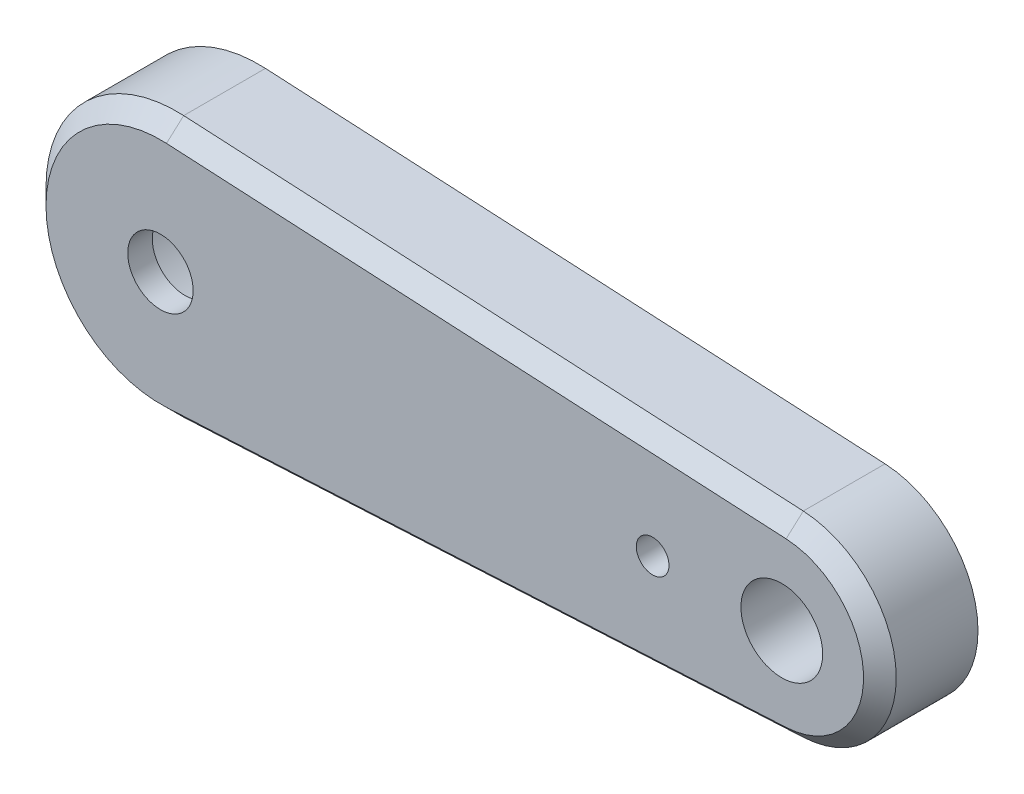
ISO-10303-21;
HEADER;
FILE_DESCRIPTION(('STEP AP214'),'2;1');
FILE_NAME('part.step','',(''),(''),'','','');
FILE_SCHEMA(('AUTOMOTIVE_DESIGN { 1 0 10303 214 1 1 1 1 }'));
ENDSEC;
DATA;
#1=APPLICATION_CONTEXT('core data for automotive mechanical design processes');
#2=APPLICATION_PROTOCOL_DEFINITION('international standard','automotive_design',2000,#1);
#3=PRODUCT_CONTEXT('',#1,'mechanical');
#4=PRODUCT('Part','Part','',(#3));
#5=PRODUCT_RELATED_PRODUCT_CATEGORY('part','',(#4));
#6=PRODUCT_DEFINITION_FORMATION('','',#4);
#7=PRODUCT_DEFINITION_CONTEXT('part definition',#1,'design');
#8=PRODUCT_DEFINITION('design','',#6,#7);
#9=PRODUCT_DEFINITION_SHAPE('','',#8);
#10=(LENGTH_UNIT() NAMED_UNIT(*) SI_UNIT(.MILLI.,.METRE.));
#11=(NAMED_UNIT(*) PLANE_ANGLE_UNIT() SI_UNIT($,.RADIAN.));
#12=(NAMED_UNIT(*) SI_UNIT($,.STERADIAN.) SOLID_ANGLE_UNIT());
#13=UNCERTAINTY_MEASURE_WITH_UNIT(LENGTH_MEASURE(1.E-05),#10,'distance_accuracy_value','');
#14=(GEOMETRIC_REPRESENTATION_CONTEXT(3) GLOBAL_UNCERTAINTY_ASSIGNED_CONTEXT((#13)) GLOBAL_UNIT_ASSIGNED_CONTEXT((#10,
#11,#12)) REPRESENTATION_CONTEXT('',''));
#15=CARTESIAN_POINT('',(0.,0.,0.));
#16=DIRECTION('',(0.,0.,1.));
#17=DIRECTION('',(1.,0.,0.));
#18=AXIS2_PLACEMENT_3D('',#15,#16,#17);
#19=CARTESIAN_POINT('',(0.,0.,3.));
#20=DIRECTION('',(0.,0.,-1.));
#21=DIRECTION('',(-1.,0.,0.));
#22=AXIS2_PLACEMENT_3D('',#19,#20,#21);
#23=CYLINDRICAL_SURFACE('',#22,1.);
#24=CARTESIAN_POINT('',(0.,0.,3.));
#25=DIRECTION('',(0.,0.,1.));
#26=DIRECTION('',(1.,0.,0.));
#27=AXIS2_PLACEMENT_3D('',#24,#25,#26);
#28=CIRCLE('',#27,1.);
#29=CARTESIAN_POINT('',(1.,0.,3.));
#30=VERTEX_POINT('',#29);
#31=EDGE_CURVE('E171',#30,#30,#28,.T.);
#32=ORIENTED_EDGE('',*,*,#31,.T.);
#33=EDGE_LOOP('',(#32));
#34=FACE_BOUND('',#33,.T.);
#35=CARTESIAN_POINT('',(0.,0.,2.25));
#36=DIRECTION('',(0.,0.,-1.));
#37=DIRECTION('',(-1.,0.,0.));
#38=AXIS2_PLACEMENT_3D('',#35,#36,#37);
#39=CIRCLE('',#38,1.);
#40=CARTESIAN_POINT('',(-1.,0.,2.25));
#41=VERTEX_POINT('',#40);
#42=EDGE_CURVE('E158',#41,#41,#39,.T.);
#43=ORIENTED_EDGE('',*,*,#42,.T.);
#44=EDGE_LOOP('',(#43));
#45=FACE_BOUND('',#44,.T.);
#46=ADVANCED_FACE('F43',(#34,#45),#23,.F.);
#47=CARTESIAN_POINT('',(0.,0.,3.));
#48=DIRECTION('',(0.,0.,1.));
#49=DIRECTION('',(1.,0.,0.));
#50=AXIS2_PLACEMENT_3D('',#47,#48,#49);
#51=PLANE('',#50);
#52=CARTESIAN_POINT('',(0.,0.,3.));
#53=DIRECTION('',(0.,0.,1.));
#54=DIRECTION('',(1.,0.,0.));
#55=AXIS2_PLACEMENT_3D('',#52,#53,#54);
#56=CIRCLE('',#55,3.5);
#57=CARTESIAN_POINT('',(0.184210526315789,3.49514899281768,3.));
#58=VERTEX_POINT('',#57);
#59=CARTESIAN_POINT('',(0.184210526315789,-3.49514899281768,3.));
#60=VERTEX_POINT('',#59);
#61=EDGE_CURVE('E201',#58,#60,#56,.T.);
#62=ORIENTED_EDGE('',*,*,#61,.T.);
#63=DIRECTION('',(0.998613997947909,0.0526315789473685,0.));
#64=VECTOR('',#63,1.);
#65=CARTESIAN_POINT('',(19.1315789473684,-2.49653499486977,3.));
#66=LINE('',#65,#64);
#67=CARTESIAN_POINT('',(19.1315789473684,-2.49653499486977,3.));
#68=VERTEX_POINT('',#67);
#69=EDGE_CURVE('E205',#60,#68,#66,.T.);
#70=ORIENTED_EDGE('',*,*,#69,.T.);
#71=CARTESIAN_POINT('',(19.,0.,3.));
#72=DIRECTION('',(0.,0.,1.));
#73=DIRECTION('',(1.,0.,0.));
#74=AXIS2_PLACEMENT_3D('',#71,#72,#73);
#75=CIRCLE('',#74,2.5);
#76=CARTESIAN_POINT('',(19.1315789473684,2.49653499486977,3.));
#77=VERTEX_POINT('',#76);
#78=EDGE_CURVE('E203',#68,#77,#75,.T.);
#79=ORIENTED_EDGE('',*,*,#78,.T.);
#80=DIRECTION('',(-0.998613997947909,0.0526315789473685,0.));
#81=VECTOR('',#80,1.);
#82=CARTESIAN_POINT('',(0.184210526315789,3.49514899281768,3.));
#83=LINE('',#82,#81);
#84=EDGE_CURVE('E196',#77,#58,#83,.T.);
#85=ORIENTED_EDGE('',*,*,#84,.T.);
#86=EDGE_LOOP('',(#62,#70,#79,#85));
#87=FACE_BOUND('',#86,.T.);
#88=CARTESIAN_POINT('',(15.05,0.,3.));
#89=DIRECTION('',(0.,0.,-1.));
#90=DIRECTION('',(-1.,0.,0.));
#91=AXIS2_PLACEMENT_3D('',#88,#89,#90);
#92=CIRCLE('',#91,0.500000000000001);
#93=CARTESIAN_POINT('',(14.55,0.,3.));
#94=VERTEX_POINT('',#93);
#95=EDGE_CURVE('E229',#94,#94,#92,.T.);
#96=ORIENTED_EDGE('',*,*,#95,.T.);
#97=EDGE_LOOP('',(#96));
#98=FACE_BOUND('',#97,.T.);
#99=ORIENTED_EDGE('',*,*,#31,.F.);
#100=EDGE_LOOP('',(#99));
#101=FACE_BOUND('',#100,.T.);
#102=CARTESIAN_POINT('',(19.,0.,3.));
#103=DIRECTION('',(0.,0.,1.));
#104=DIRECTION('',(1.,0.,0.));
#105=AXIS2_PLACEMENT_3D('',#102,#103,#104);
#106=CIRCLE('',#105,1.25);
#107=CARTESIAN_POINT('',(20.25,0.,3.));
#108=VERTEX_POINT('',#107);
#109=EDGE_CURVE('E168',#108,#108,#106,.T.);
#110=ORIENTED_EDGE('',*,*,#109,.F.);
#111=EDGE_LOOP('',(#110));
#112=FACE_BOUND('',#111,.T.);
#113=ADVANCED_FACE('F259',(#87,#98,#101,#112),#51,.T.);
#114=CARTESIAN_POINT('',(0.,0.,0.));
#115=DIRECTION('',(0.,0.,1.));
#116=DIRECTION('',(1.,0.,0.));
#117=AXIS2_PLACEMENT_3D('',#114,#115,#116);
#118=PLANE('',#117);
#119=DIRECTION('',(0.998917748600676,-0.0465116279069769,0.));
#120=VECTOR('',#119,1.);
#121=CARTESIAN_POINT('',(15.1546511627907,2.24756493435152,0.));
#122=LINE('',#121,#120);
#123=CARTESIAN_POINT('',(0.137209302325582,2.94680735837199,0.));
#124=VERTEX_POINT('',#123);
#125=CARTESIAN_POINT('',(15.1546511627907,2.24756493435152,0.));
#126=VERTEX_POINT('',#125);
#127=EDGE_CURVE('E157',#124,#126,#122,.T.);
#128=ORIENTED_EDGE('',*,*,#127,.F.);
#129=CARTESIAN_POINT('',(0.,0.,0.));
#130=DIRECTION('',(0.,0.,-1.));
#131=DIRECTION('',(1.,0.,0.));
#132=AXIS2_PLACEMENT_3D('',#129,#130,#131);
#133=CIRCLE('',#132,2.95);
#134=CARTESIAN_POINT('',(0.137209302325581,-2.94680735837199,0.));
#135=VERTEX_POINT('',#134);
#136=EDGE_CURVE('E128',#135,#124,#133,.T.);
#137=ORIENTED_EDGE('',*,*,#136,.F.);
#138=DIRECTION('',(-0.998917748600676,-0.0465116279069766,0.));
#139=VECTOR('',#138,1.);
#140=CARTESIAN_POINT('',(15.1546511627907,-2.24756493435152,0.));
#141=LINE('',#140,#139);
#142=CARTESIAN_POINT('',(15.1546511627907,-2.24756493435152,0.));
#143=VERTEX_POINT('',#142);
#144=EDGE_CURVE('E145',#143,#135,#141,.T.);
#145=ORIENTED_EDGE('',*,*,#144,.F.);
#146=CARTESIAN_POINT('',(15.05,0.,0.));
#147=DIRECTION('',(0.,0.,-1.));
#148=DIRECTION('',(-1.,0.,0.));
#149=AXIS2_PLACEMENT_3D('',#146,#147,#148);
#150=CIRCLE('',#149,2.25);
#151=EDGE_CURVE('E148',#126,#143,#150,.T.);
#152=ORIENTED_EDGE('',*,*,#151,.F.);
#153=EDGE_LOOP('',(#128,#137,#145,#152));
#154=FACE_BOUND('',#153,.T.);
#155=CARTESIAN_POINT('',(0.,0.,0.));
#156=DIRECTION('',(0.,0.,1.));
#157=DIRECTION('',(1.,0.,0.));
#158=AXIS2_PLACEMENT_3D('',#155,#156,#157);
#159=CIRCLE('',#158,4.);
#160=CARTESIAN_POINT('',(0.210526315789474,3.99445599179164,0.));
#161=VERTEX_POINT('',#160);
#162=CARTESIAN_POINT('',(0.210526315789474,-3.99445599179164,0.));
#163=VERTEX_POINT('',#162);
#164=EDGE_CURVE('E176',#161,#163,#159,.T.);
#165=ORIENTED_EDGE('',*,*,#164,.F.);
#166=DIRECTION('',(-0.998613997947909,0.0526315789473684,0.));
#167=VECTOR('',#166,1.);
#168=CARTESIAN_POINT('',(0.210526315789474,3.99445599179164,0.));
#169=LINE('',#168,#167);
#170=CARTESIAN_POINT('',(19.1578947368421,2.99584199384373,0.));
#171=VERTEX_POINT('',#170);
#172=EDGE_CURVE('E185',#171,#161,#169,.T.);
#173=ORIENTED_EDGE('',*,*,#172,.F.);
#174=CARTESIAN_POINT('',(19.,0.,0.));
#175=DIRECTION('',(0.,0.,1.));
#176=DIRECTION('',(1.,0.,0.));
#177=AXIS2_PLACEMENT_3D('',#174,#175,#176);
#178=CIRCLE('',#177,3.);
#179=CARTESIAN_POINT('',(19.1578947368421,-2.99584199384373,0.));
#180=VERTEX_POINT('',#179);
#181=EDGE_CURVE('E182',#180,#171,#178,.T.);
#182=ORIENTED_EDGE('',*,*,#181,.F.);
#183=DIRECTION('',(0.998613997947909,0.0526315789473685,0.));
#184=VECTOR('',#183,1.);
#185=CARTESIAN_POINT('',(0.210526315789474,-3.99445599179164,0.));
#186=LINE('',#185,#184);
#187=EDGE_CURVE('E179',#163,#180,#186,.T.);
#188=ORIENTED_EDGE('',*,*,#187,.F.);
#189=EDGE_LOOP('',(#165,#173,#182,#188));
#190=FACE_BOUND('',#189,.T.);
#191=CARTESIAN_POINT('',(19.,0.,0.));
#192=DIRECTION('',(0.,0.,1.));
#193=DIRECTION('',(1.,0.,0.));
#194=AXIS2_PLACEMENT_3D('',#191,#192,#193);
#195=CIRCLE('',#194,1.25);
#196=CARTESIAN_POINT('',(20.25,0.,0.));
#197=VERTEX_POINT('',#196);
#198=EDGE_CURVE('E164',#197,#197,#195,.T.);
#199=ORIENTED_EDGE('',*,*,#198,.T.);
#200=EDGE_LOOP('',(#199));
#201=FACE_BOUND('',#200,.T.);
#202=ADVANCED_FACE('F265',(#154,#190,#201),#118,.F.);
#203=CARTESIAN_POINT('',(0.,0.,3.));
#204=DIRECTION('',(0.,0.,-1.));
#205=DIRECTION('',(-1.,0.,0.));
#206=AXIS2_PLACEMENT_3D('',#203,#204,#205);
#207=CYLINDRICAL_SURFACE('',#206,4.);
#208=DIRECTION('',(0.,0.,-1.));
#209=VECTOR('',#208,1.);
#210=CARTESIAN_POINT('',(0.210526315789474,-3.99445599179164,3.));
#211=LINE('',#210,#209);
#212=CARTESIAN_POINT('',(0.210526315789474,-3.99445599179164,2.5));
#213=VERTEX_POINT('',#212);
#214=EDGE_CURVE('E194',#213,#163,#211,.T.);
#215=ORIENTED_EDGE('',*,*,#214,.F.);
#216=CARTESIAN_POINT('',(0.,0.,2.5));
#217=DIRECTION('',(0.,0.,1.));
#218=DIRECTION('',(1.,0.,0.));
#219=AXIS2_PLACEMENT_3D('',#216,#217,#218);
#220=CIRCLE('',#219,4.);
#221=CARTESIAN_POINT('',(0.210526315789474,3.99445599179164,2.5));
#222=VERTEX_POINT('',#221);
#223=EDGE_CURVE('E53',#213,#222,#220,.F.);
#224=ORIENTED_EDGE('',*,*,#223,.T.);
#225=DIRECTION('',(0.,0.,-1.));
#226=VECTOR('',#225,1.);
#227=CARTESIAN_POINT('',(0.210526315789474,3.99445599179164,3.));
#228=LINE('',#227,#226);
#229=EDGE_CURVE('E188',#222,#161,#228,.T.);
#230=ORIENTED_EDGE('',*,*,#229,.T.);
#231=ORIENTED_EDGE('',*,*,#164,.T.);
#232=EDGE_LOOP('',(#215,#224,#230,#231));
#233=FACE_BOUND('',#232,.T.);
#234=ADVANCED_FACE('F275',(#233),#207,.T.);
#235=CARTESIAN_POINT('',(0.210526315789474,-3.99445599179164,3.));
#236=DIRECTION('',(-0.0526315789473685,0.998613997947909,0.));
#237=DIRECTION('',(-0.998613997947909,-0.0526315789473685,0.));
#238=AXIS2_PLACEMENT_3D('',#235,#236,#237);
#239=PLANE('',#238);
#240=DIRECTION('',(0.,0.,-1.));
#241=VECTOR('',#240,1.);
#242=CARTESIAN_POINT('',(19.1578947368421,-2.99584199384373,3.));
#243=LINE('',#242,#241);
#244=CARTESIAN_POINT('',(19.1578947368421,-2.99584199384373,2.5));
#245=VERTEX_POINT('',#244);
#246=EDGE_CURVE('E192',#245,#180,#243,.T.);
#247=ORIENTED_EDGE('',*,*,#246,.F.);
#248=DIRECTION('',(-0.998613997947909,-0.0526315789473685,0.));
#249=VECTOR('',#248,1.);
#250=CARTESIAN_POINT('',(0.210526315789474,-3.99445599179164,2.5));
#251=LINE('',#250,#249);
#252=EDGE_CURVE('E208',#245,#213,#251,.T.);
#253=ORIENTED_EDGE('',*,*,#252,.T.);
#254=ORIENTED_EDGE('',*,*,#214,.T.);
#255=ORIENTED_EDGE('',*,*,#187,.T.);
#256=EDGE_LOOP('',(#247,#253,#254,#255));
#257=FACE_BOUND('',#256,.T.);
#258=ADVANCED_FACE('F283',(#257),#239,.F.);
#259=CARTESIAN_POINT('',(19.,0.,3.));
#260=DIRECTION('',(0.,0.,-1.));
#261=DIRECTION('',(-1.,0.,0.));
#262=AXIS2_PLACEMENT_3D('',#259,#260,#261);
#263=CYLINDRICAL_SURFACE('',#262,3.);
#264=DIRECTION('',(0.,0.,-1.));
#265=VECTOR('',#264,1.);
#266=CARTESIAN_POINT('',(19.1578947368421,2.99584199384373,3.));
#267=LINE('',#266,#265);
#268=CARTESIAN_POINT('',(19.1578947368421,2.99584199384373,2.5));
#269=VERTEX_POINT('',#268);
#270=EDGE_CURVE('E190',#269,#171,#267,.T.);
#271=ORIENTED_EDGE('',*,*,#270,.F.);
#272=CARTESIAN_POINT('',(19.,0.,2.5));
#273=DIRECTION('',(0.,0.,1.));
#274=DIRECTION('',(1.,0.,0.));
#275=AXIS2_PLACEMENT_3D('',#272,#273,#274);
#276=CIRCLE('',#275,3.);
#277=EDGE_CURVE('E211',#269,#245,#276,.F.);
#278=ORIENTED_EDGE('',*,*,#277,.T.);
#279=ORIENTED_EDGE('',*,*,#246,.T.);
#280=ORIENTED_EDGE('',*,*,#181,.T.);
#281=EDGE_LOOP('',(#271,#278,#279,#280));
#282=FACE_BOUND('',#281,.T.);
#283=ADVANCED_FACE('F280',(#282),#263,.T.);
#284=CARTESIAN_POINT('',(0.210526315789474,3.99445599179164,3.));
#285=DIRECTION('',(-0.0526315789473684,-0.998613997947909,0.));
#286=DIRECTION('',(0.998613997947909,-0.0526315789473685,0.));
#287=AXIS2_PLACEMENT_3D('',#284,#285,#286);
#288=PLANE('',#287);
#289=ORIENTED_EDGE('',*,*,#229,.F.);
#290=DIRECTION('',(0.998613997947909,-0.0526315789473685,0.));
#291=VECTOR('',#290,1.);
#292=CARTESIAN_POINT('',(19.1578947368421,2.99584199384373,2.5));
#293=LINE('',#292,#291);
#294=EDGE_CURVE('E11',#222,#269,#293,.T.);
#295=ORIENTED_EDGE('',*,*,#294,.T.);
#296=ORIENTED_EDGE('',*,*,#270,.T.);
#297=ORIENTED_EDGE('',*,*,#172,.T.);
#298=EDGE_LOOP('',(#289,#295,#296,#297));
#299=FACE_BOUND('',#298,.T.);
#300=ADVANCED_FACE('F277',(#299),#288,.F.);
#301=CARTESIAN_POINT('',(19.,0.,3.));
#302=DIRECTION('',(0.,0.,-1.));
#303=DIRECTION('',(-1.,0.,0.));
#304=AXIS2_PLACEMENT_3D('',#301,#302,#303);
#305=CYLINDRICAL_SURFACE('',#304,1.25);
#306=ORIENTED_EDGE('',*,*,#109,.T.);
#307=EDGE_LOOP('',(#306));
#308=FACE_BOUND('',#307,.T.);
#309=ORIENTED_EDGE('',*,*,#198,.F.);
#310=EDGE_LOOP('',(#309));
#311=FACE_BOUND('',#310,.T.);
#312=ADVANCED_FACE('F270',(#308,#311),#305,.F.);
#313=CARTESIAN_POINT('',(0.,0.,1.5));
#314=DIRECTION('',(0.,0.,-1.));
#315=DIRECTION('',(-1.,0.,0.));
#316=AXIS2_PLACEMENT_3D('',#313,#314,#315);
#317=CYLINDRICAL_SURFACE('',#316,2.95);
#318=ORIENTED_EDGE('',*,*,#136,.T.);
#319=DIRECTION('',(0.,0.,-1.));
#320=VECTOR('',#319,1.);
#321=CARTESIAN_POINT('',(0.137209302325582,2.94680735837199,1.5));
#322=LINE('',#321,#320);
#323=CARTESIAN_POINT('',(0.137209302325582,2.94680735837199,1.5));
#324=VERTEX_POINT('',#323);
#325=EDGE_CURVE('E121',#324,#124,#322,.T.);
#326=ORIENTED_EDGE('',*,*,#325,.F.);
#327=CARTESIAN_POINT('',(0.,0.,1.5));
#328=DIRECTION('',(0.,0.,-1.));
#329=DIRECTION('',(1.,0.,0.));
#330=AXIS2_PLACEMENT_3D('',#327,#328,#329);
#331=CIRCLE('',#330,2.95);
#332=CARTESIAN_POINT('',(0.137209302325581,-2.94680735837199,1.5));
#333=VERTEX_POINT('',#332);
#334=EDGE_CURVE('E125',#333,#324,#331,.T.);
#335=ORIENTED_EDGE('',*,*,#334,.F.);
#336=DIRECTION('',(0.,0.,-1.));
#337=VECTOR('',#336,1.);
#338=CARTESIAN_POINT('',(0.137209302325581,-2.94680735837199,1.5));
#339=LINE('',#338,#337);
#340=EDGE_CURVE('E162',#333,#135,#339,.T.);
#341=ORIENTED_EDGE('',*,*,#340,.T.);
#342=EDGE_LOOP('',(#318,#326,#335,#341));
#343=FACE_BOUND('',#342,.T.);
#344=ADVANCED_FACE('F123',(#343),#317,.F.);
#345=CARTESIAN_POINT('',(15.1546511627907,-2.24756493435152,1.5));
#346=DIRECTION('',(0.0465116279069766,-0.998917748600676,0.));
#347=DIRECTION('',(0.998917748600676,0.0465116279069766,0.));
#348=AXIS2_PLACEMENT_3D('',#345,#346,#347);
#349=PLANE('',#348);
#350=ORIENTED_EDGE('',*,*,#144,.T.);
#351=ORIENTED_EDGE('',*,*,#340,.F.);
#352=DIRECTION('',(-0.998917748600676,-0.0465116279069766,0.));
#353=VECTOR('',#352,1.);
#354=CARTESIAN_POINT('',(15.1546511627907,-2.24756493435152,1.5));
#355=LINE('',#354,#353);
#356=CARTESIAN_POINT('',(15.1546511627907,-2.24756493435152,1.5));
#357=VERTEX_POINT('',#356);
#358=EDGE_CURVE('E133',#357,#333,#355,.T.);
#359=ORIENTED_EDGE('',*,*,#358,.F.);
#360=DIRECTION('',(0.,0.,-1.));
#361=VECTOR('',#360,1.);
#362=CARTESIAN_POINT('',(15.1546511627907,-2.24756493435152,1.5));
#363=LINE('',#362,#361);
#364=EDGE_CURVE('E165',#357,#143,#363,.T.);
#365=ORIENTED_EDGE('',*,*,#364,.T.);
#366=EDGE_LOOP('',(#350,#351,#359,#365));
#367=FACE_BOUND('',#366,.T.);
#368=ADVANCED_FACE('F338',(#367),#349,.F.);
#369=CARTESIAN_POINT('',(15.05,0.,1.5));
#370=DIRECTION('',(0.,0.,-1.));
#371=DIRECTION('',(-1.,0.,0.));
#372=AXIS2_PLACEMENT_3D('',#369,#370,#371);
#373=CYLINDRICAL_SURFACE('',#372,2.25);
#374=ORIENTED_EDGE('',*,*,#151,.T.);
#375=ORIENTED_EDGE('',*,*,#364,.F.);
#376=CARTESIAN_POINT('',(15.05,0.,1.5));
#377=DIRECTION('',(0.,0.,-1.));
#378=DIRECTION('',(-1.,0.,0.));
#379=AXIS2_PLACEMENT_3D('',#376,#377,#378);
#380=CIRCLE('',#379,2.25);
#381=CARTESIAN_POINT('',(15.1546511627907,2.24756493435152,1.5));
#382=VERTEX_POINT('',#381);
#383=EDGE_CURVE('E141',#382,#357,#380,.T.);
#384=ORIENTED_EDGE('',*,*,#383,.F.);
#385=DIRECTION('',(0.,0.,-1.));
#386=VECTOR('',#385,1.);
#387=CARTESIAN_POINT('',(15.1546511627907,2.24756493435152,1.5));
#388=LINE('',#387,#386);
#389=EDGE_CURVE('E132',#382,#126,#388,.T.);
#390=ORIENTED_EDGE('',*,*,#389,.T.);
#391=EDGE_LOOP('',(#374,#375,#384,#390));
#392=FACE_BOUND('',#391,.T.);
#393=ADVANCED_FACE('F255',(#392),#373,.F.);
#394=CARTESIAN_POINT('',(15.1546511627907,2.24756493435152,1.5));
#395=DIRECTION('',(0.0465116279069769,0.998917748600676,0.));
#396=DIRECTION('',(-0.998917748600676,0.0465116279069769,0.));
#397=AXIS2_PLACEMENT_3D('',#394,#395,#396);
#398=PLANE('',#397);
#399=ORIENTED_EDGE('',*,*,#127,.T.);
#400=ORIENTED_EDGE('',*,*,#389,.F.);
#401=DIRECTION('',(0.998917748600676,-0.0465116279069769,0.));
#402=VECTOR('',#401,1.);
#403=CARTESIAN_POINT('',(15.1546511627907,2.24756493435152,1.5));
#404=LINE('',#403,#402);
#405=EDGE_CURVE('E136',#324,#382,#404,.T.);
#406=ORIENTED_EDGE('',*,*,#405,.F.);
#407=ORIENTED_EDGE('',*,*,#325,.T.);
#408=EDGE_LOOP('',(#399,#400,#406,#407));
#409=FACE_BOUND('',#408,.T.);
#410=ADVANCED_FACE('F137',(#409),#398,.F.);
#411=CARTESIAN_POINT('',(0.,0.,1.5));
#412=DIRECTION('',(0.,0.,1.));
#413=DIRECTION('',(1.,0.,0.));
#414=AXIS2_PLACEMENT_3D('',#411,#412,#413);
#415=PLANE('',#414);
#416=CARTESIAN_POINT('',(15.05,0.,1.5));
#417=DIRECTION('',(0.,0.,-1.));
#418=DIRECTION('',(-1.,0.,0.));
#419=AXIS2_PLACEMENT_3D('',#416,#417,#418);
#420=CIRCLE('',#419,0.500000000000001);
#421=CARTESIAN_POINT('',(14.55,0.,1.5));
#422=VERTEX_POINT('',#421);
#423=EDGE_CURVE('E224',#422,#422,#420,.T.);
#424=ORIENTED_EDGE('',*,*,#423,.F.);
#425=EDGE_LOOP('',(#424));
#426=FACE_BOUND('',#425,.T.);
#427=CARTESIAN_POINT('',(0.,0.,1.5));
#428=DIRECTION('',(0.,0.,-1.));
#429=DIRECTION('',(-1.,0.,0.));
#430=AXIS2_PLACEMENT_3D('',#427,#428,#429);
#431=CIRCLE('',#430,2.1);
#432=CARTESIAN_POINT('',(-2.1,0.,1.5));
#433=VERTEX_POINT('',#432);
#434=EDGE_CURVE('E151',#433,#433,#431,.T.);
#435=ORIENTED_EDGE('',*,*,#434,.F.);
#436=EDGE_LOOP('',(#435));
#437=FACE_BOUND('',#436,.T.);
#438=ORIENTED_EDGE('',*,*,#334,.T.);
#439=ORIENTED_EDGE('',*,*,#405,.T.);
#440=ORIENTED_EDGE('',*,*,#383,.T.);
#441=ORIENTED_EDGE('',*,*,#358,.T.);
#442=EDGE_LOOP('',(#438,#439,#440,#441));
#443=FACE_BOUND('',#442,.T.);
#444=ADVANCED_FACE('F143',(#426,#437,#443),#415,.F.);
#445=CARTESIAN_POINT('',(0.,0.,2.25));
#446=DIRECTION('',(0.,0.,-1.));
#447=DIRECTION('',(-1.,0.,0.));
#448=AXIS2_PLACEMENT_3D('',#445,#446,#447);
#449=CYLINDRICAL_SURFACE('',#448,2.1);
#450=CARTESIAN_POINT('',(0.,0.,2.25));
#451=DIRECTION('',(0.,0.,-1.));
#452=DIRECTION('',(-1.,0.,0.));
#453=AXIS2_PLACEMENT_3D('',#450,#451,#452);
#454=CIRCLE('',#453,2.1);
#455=CARTESIAN_POINT('',(-2.1,0.,2.25));
#456=VERTEX_POINT('',#455);
#457=EDGE_CURVE('E199',#456,#456,#454,.T.);
#458=ORIENTED_EDGE('',*,*,#457,.F.);
#459=EDGE_LOOP('',(#458));
#460=FACE_BOUND('',#459,.T.);
#461=ORIENTED_EDGE('',*,*,#434,.T.);
#462=EDGE_LOOP('',(#461));
#463=FACE_BOUND('',#462,.T.);
#464=ADVANCED_FACE('F241',(#460,#463),#449,.F.);
#465=CARTESIAN_POINT('',(0.,0.,2.25));
#466=DIRECTION('',(0.,0.,-1.));
#467=DIRECTION('',(-1.,0.,0.));
#468=AXIS2_PLACEMENT_3D('',#465,#466,#467);
#469=PLANE('',#468);
#470=ORIENTED_EDGE('',*,*,#42,.F.);
#471=EDGE_LOOP('',(#470));
#472=FACE_BOUND('',#471,.T.);
#473=ORIENTED_EDGE('',*,*,#457,.T.);
#474=EDGE_LOOP('',(#473));
#475=FACE_BOUND('',#474,.T.);
#476=ADVANCED_FACE('F251',(#472,#475),#469,.T.);
#477=CARTESIAN_POINT('',(15.05,0.,3.));
#478=DIRECTION('',(0.,0.,-1.));
#479=DIRECTION('',(-1.,0.,0.));
#480=AXIS2_PLACEMENT_3D('',#477,#478,#479);
#481=CYLINDRICAL_SURFACE('',#480,0.500000000000001);
#482=ORIENTED_EDGE('',*,*,#95,.F.);
#483=EDGE_LOOP('',(#482));
#484=FACE_BOUND('',#483,.T.);
#485=ORIENTED_EDGE('',*,*,#423,.T.);
#486=EDGE_LOOP('',(#485));
#487=FACE_BOUND('',#486,.T.);
#488=ADVANCED_FACE('F310',(#484,#487),#481,.F.);
#489=CARTESIAN_POINT('',(0.184210526315789,3.49514899281768,3.));
#490=DIRECTION('',(0.0372161463782394,0.706126729736777,0.707106781186547));
#491=DIRECTION('',(0.998613997947909,-0.0526315789473685,0.));
#492=AXIS2_PLACEMENT_3D('',#489,#490,#491);
#493=PLANE('',#492);
#494=DIRECTION('',(-0.0372161463782379,-0.706126729736775,0.707106781186549));
#495=VECTOR('',#494,1.);
#496=CARTESIAN_POINT('',(19.1578947368421,2.99584199384373,2.5));
#497=LINE('',#496,#495);
#498=EDGE_CURVE('E217',#269,#77,#497,.T.);
#499=ORIENTED_EDGE('',*,*,#498,.F.);
#500=ORIENTED_EDGE('',*,*,#294,.F.);
#501=DIRECTION('',(0.0372161463782393,0.706126729736775,-0.707106781186549));
#502=VECTOR('',#501,1.);
#503=CARTESIAN_POINT('',(0.184210526315789,3.49514899281768,3.));
#504=LINE('',#503,#502);
#505=EDGE_CURVE('E48',#58,#222,#504,.T.);
#506=ORIENTED_EDGE('',*,*,#505,.F.);
#507=ORIENTED_EDGE('',*,*,#84,.F.);
#508=EDGE_LOOP('',(#499,#500,#506,#507));
#509=FACE_BOUND('',#508,.T.);
#510=ADVANCED_FACE('F46',(#509),#493,.T.);
#511=CARTESIAN_POINT('',(0.,0.,3.));
#512=DIRECTION('',(0.,0.,-1.));
#513=DIRECTION('',(-1.,0.,0.));
#514=AXIS2_PLACEMENT_3D('',#511,#512,#513);
#515=CONICAL_SURFACE('',#514,3.5,0.785398163397447);
#516=ORIENTED_EDGE('',*,*,#505,.T.);
#517=ORIENTED_EDGE('',*,*,#223,.F.);
#518=DIRECTION('',(0.0372161463782393,-0.706126729736775,-0.707106781186549));
#519=VECTOR('',#518,1.);
#520=CARTESIAN_POINT('',(0.184210526315789,-3.49514899281768,3.));
#521=LINE('',#520,#519);
#522=EDGE_CURVE('E216',#60,#213,#521,.T.);
#523=ORIENTED_EDGE('',*,*,#522,.F.);
#524=ORIENTED_EDGE('',*,*,#61,.F.);
#525=EDGE_LOOP('',(#516,#517,#523,#524));
#526=FACE_BOUND('',#525,.T.);
#527=ADVANCED_FACE('F303',(#526),#515,.T.);
#528=CARTESIAN_POINT('',(19.,0.,3.));
#529=DIRECTION('',(0.,0.,-1.));
#530=DIRECTION('',(-1.,0.,0.));
#531=AXIS2_PLACEMENT_3D('',#528,#529,#530);
#532=CONICAL_SURFACE('',#531,2.5,0.785398163397447);
#533=ORIENTED_EDGE('',*,*,#498,.T.);
#534=ORIENTED_EDGE('',*,*,#78,.F.);
#535=DIRECTION('',(-0.0372161463782378,0.706126729736775,0.707106781186548));
#536=VECTOR('',#535,1.);
#537=CARTESIAN_POINT('',(19.1578947368421,-2.99584199384373,2.5));
#538=LINE('',#537,#536);
#539=EDGE_CURVE('E214',#245,#68,#538,.T.);
#540=ORIENTED_EDGE('',*,*,#539,.F.);
#541=ORIENTED_EDGE('',*,*,#277,.F.);
#542=EDGE_LOOP('',(#533,#534,#540,#541));
#543=FACE_BOUND('',#542,.T.);
#544=ADVANCED_FACE('F297',(#543),#532,.T.);
#545=CARTESIAN_POINT('',(0.18421052631579,-3.49514899281768,3.));
#546=DIRECTION('',(0.0372161463782395,-0.706126729736777,0.707106781186546));
#547=DIRECTION('',(-0.998613997947909,-0.0526315789473685,0.));
#548=AXIS2_PLACEMENT_3D('',#545,#546,#547);
#549=PLANE('',#548);
#550=ORIENTED_EDGE('',*,*,#522,.T.);
#551=ORIENTED_EDGE('',*,*,#252,.F.);
#552=ORIENTED_EDGE('',*,*,#539,.T.);
#553=ORIENTED_EDGE('',*,*,#69,.F.);
#554=EDGE_LOOP('',(#550,#551,#552,#553));
#555=FACE_BOUND('',#554,.T.);
#556=ADVANCED_FACE('F291',(#555),#549,.T.);
#557=CLOSED_SHELL('',(#46,#113,#202,#234,#258,#283,#300,#312,#344,#368,#393,#410,#444,#464,#476,
#488,#510,#527,#544,#556));
#558=MANIFOLD_SOLID_BREP('B2',#557);
#559=ADVANCED_BREP_SHAPE_REPRESENTATION('',(#18,#558),#14);
#560=SHAPE_DEFINITION_REPRESENTATION(#9,#559);
ENDSEC;
END-ISO-10303-21;
